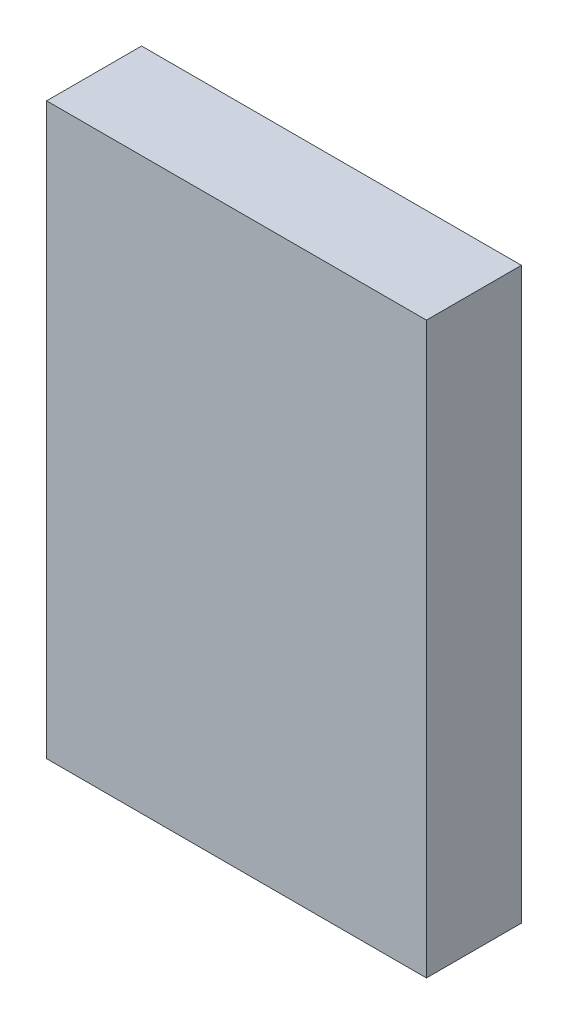
ISO-10303-21;
HEADER;
FILE_DESCRIPTION(('STEP AP214'),'2;1');
FILE_NAME('part.step','',(''),(''),'','','');
FILE_SCHEMA(('AUTOMOTIVE_DESIGN { 1 0 10303 214 1 1 1 1 }'));
ENDSEC;
DATA;
#1=APPLICATION_CONTEXT('core data for automotive mechanical design processes');
#2=APPLICATION_PROTOCOL_DEFINITION('international standard','automotive_design',2000,#1);
#3=PRODUCT_CONTEXT('',#1,'mechanical');
#4=PRODUCT('Part','Part','',(#3));
#5=PRODUCT_RELATED_PRODUCT_CATEGORY('part','',(#4));
#6=PRODUCT_DEFINITION_FORMATION('','',#4);
#7=PRODUCT_DEFINITION_CONTEXT('part definition',#1,'design');
#8=PRODUCT_DEFINITION('design','',#6,#7);
#9=PRODUCT_DEFINITION_SHAPE('','',#8);
#10=(LENGTH_UNIT() NAMED_UNIT(*) SI_UNIT(.MILLI.,.METRE.));
#11=(NAMED_UNIT(*) PLANE_ANGLE_UNIT() SI_UNIT($,.RADIAN.));
#12=(NAMED_UNIT(*) SI_UNIT($,.STERADIAN.) SOLID_ANGLE_UNIT());
#13=UNCERTAINTY_MEASURE_WITH_UNIT(LENGTH_MEASURE(1.E-05),#10,'distance_accuracy_value','');
#14=(GEOMETRIC_REPRESENTATION_CONTEXT(3) GLOBAL_UNCERTAINTY_ASSIGNED_CONTEXT((#13)) GLOBAL_UNIT_ASSIGNED_CONTEXT((#10,
#11,#12)) REPRESENTATION_CONTEXT('',''));
#15=CARTESIAN_POINT('',(0.,0.,0.));
#16=DIRECTION('',(0.,0.,1.));
#17=DIRECTION('',(1.,0.,0.));
#18=AXIS2_PLACEMENT_3D('',#15,#16,#17);
#19=CARTESIAN_POINT('',(0.,0.,0.));
#20=DIRECTION('',(0.,0.,1.));
#21=DIRECTION('',(1.,0.,0.));
#22=AXIS2_PLACEMENT_3D('',#19,#20,#21);
#23=PLANE('',#22);
#24=DIRECTION('',(0.,-1.,0.));
#25=VECTOR('',#24,1.);
#26=CARTESIAN_POINT('',(-15.,-135.745255903937,0.));
#27=LINE('',#26,#25);
#28=CARTESIAN_POINT('',(-15.,-135.745255903937,0.));
#29=VERTEX_POINT('',#28);
#30=CARTESIAN_POINT('',(-15.,-195.745255903937,0.));
#31=VERTEX_POINT('',#30);
#32=EDGE_CURVE('E142',#29,#31,#27,.T.);
#33=ORIENTED_EDGE('',*,*,#32,.F.);
#34=DIRECTION('',(-1.,0.,0.));
#35=VECTOR('',#34,1.);
#36=CARTESIAN_POINT('',(-15.,-135.745255903937,0.));
#37=LINE('',#36,#35);
#38=CARTESIAN_POINT('',(25.,-135.745255903937,0.));
#39=VERTEX_POINT('',#38);
#40=EDGE_CURVE('E69',#39,#29,#37,.T.);
#41=ORIENTED_EDGE('',*,*,#40,.F.);
#42=DIRECTION('',(0.,1.,0.));
#43=VECTOR('',#42,1.);
#44=CARTESIAN_POINT('',(25.,-135.745255903937,0.));
#45=LINE('',#44,#43);
#46=CARTESIAN_POINT('',(25.,-195.745255903937,0.));
#47=VERTEX_POINT('',#46);
#48=EDGE_CURVE('E256',#47,#39,#45,.T.);
#49=ORIENTED_EDGE('',*,*,#48,.F.);
#50=DIRECTION('',(1.,0.,0.));
#51=VECTOR('',#50,1.);
#52=CARTESIAN_POINT('',(-15.,-195.745255903937,0.));
#53=LINE('',#52,#51);
#54=EDGE_CURVE('E253',#31,#47,#53,.T.);
#55=ORIENTED_EDGE('',*,*,#54,.F.);
#56=EDGE_LOOP('',(#33,#41,#49,#55));
#57=FACE_BOUND('',#56,.T.);
#58=CARTESIAN_POINT('',(4.99999999999999,-165.745255903937,0.));
#59=DIRECTION('',(0.,0.,1.));
#60=DIRECTION('',(-1.,0.,0.));
#61=AXIS2_PLACEMENT_3D('',#58,#59,#60);
#62=CIRCLE('',#61,5.99999999999999);
#63=CARTESIAN_POINT('',(9.49999999999998,-169.713882870534,0.));
#64=VERTEX_POINT('',#63);
#65=CARTESIAN_POINT('',(9.49999999999998,-161.77662893734,0.));
#66=VERTEX_POINT('',#65);
#67=EDGE_CURVE('E61',#64,#66,#62,.T.);
#68=ORIENTED_EDGE('',*,*,#67,.T.);
#69=DIRECTION('',(-0.155245679095351,0.987875892570632,0.));
#70=VECTOR('',#69,1.);
#71=CARTESIAN_POINT('',(9.49999999999998,-161.77662893734,0.));
#72=LINE('',#71,#70);
#73=CARTESIAN_POINT('',(7.46968973142657,-148.857141706198,0.));
#74=VERTEX_POINT('',#73);
#75=EDGE_CURVE('E201',#66,#74,#72,.T.);
#76=ORIENTED_EDGE('',*,*,#75,.T.);
#77=CARTESIAN_POINT('',(4.99999999999999,-149.245255903937,0.));
#78=DIRECTION('',(0.,0.,1.));
#79=DIRECTION('',(1.,0.,0.));
#80=AXIS2_PLACEMENT_3D('',#77,#78,#79);
#81=CIRCLE('',#80,2.5);
#82=CARTESIAN_POINT('',(2.53031026857342,-148.857141706198,0.));
#83=VERTEX_POINT('',#82);
#84=EDGE_CURVE('E205',#74,#83,#81,.T.);
#85=ORIENTED_EDGE('',*,*,#84,.T.);
#86=DIRECTION('',(-0.155245679095352,-0.987875892570632,0.));
#87=VECTOR('',#86,1.);
#88=CARTESIAN_POINT('',(2.53031026857341,-148.857141706198,0.));
#89=LINE('',#88,#87);
#90=CARTESIAN_POINT('',(0.499999999999983,-161.77662893734,0.));
#91=VERTEX_POINT('',#90);
#92=EDGE_CURVE('E209',#83,#91,#89,.T.);
#93=ORIENTED_EDGE('',*,*,#92,.T.);
#94=CARTESIAN_POINT('',(4.99999999999999,-165.745255903937,0.));
#95=DIRECTION('',(0.,0.,1.));
#96=DIRECTION('',(1.,0.,0.));
#97=AXIS2_PLACEMENT_3D('',#94,#95,#96);
#98=CIRCLE('',#97,6.00000000000002);
#99=CARTESIAN_POINT('',(0.499999999999974,-169.713882870534,0.));
#100=VERTEX_POINT('',#99);
#101=EDGE_CURVE('E213',#91,#100,#98,.T.);
#102=ORIENTED_EDGE('',*,*,#101,.T.);
#103=DIRECTION('',(0.155245679095353,-0.987875892570632,0.));
#104=VECTOR('',#103,1.);
#105=CARTESIAN_POINT('',(0.499999999999986,-169.713882870534,0.));
#106=LINE('',#105,#104);
#107=CARTESIAN_POINT('',(2.53031026857342,-182.633370101675,0.));
#108=VERTEX_POINT('',#107);
#109=EDGE_CURVE('E217',#100,#108,#106,.T.);
#110=ORIENTED_EDGE('',*,*,#109,.T.);
#111=CARTESIAN_POINT('',(4.99999999999999,-182.245255903937,0.));
#112=DIRECTION('',(0.,0.,1.));
#113=DIRECTION('',(-1.,0.,0.));
#114=AXIS2_PLACEMENT_3D('',#111,#112,#113);
#115=CIRCLE('',#114,2.49999999999999);
#116=CARTESIAN_POINT('',(7.46968973142657,-182.633370101675,0.));
#117=VERTEX_POINT('',#116);
#118=EDGE_CURVE('E221',#108,#117,#115,.T.);
#119=ORIENTED_EDGE('',*,*,#118,.T.);
#120=DIRECTION('',(0.155245679095352,0.987875892570632,0.));
#121=VECTOR('',#120,1.);
#122=CARTESIAN_POINT('',(9.49999999999998,-169.713882870534,0.));
#123=LINE('',#122,#121);
#124=EDGE_CURVE('E170',#117,#64,#123,.T.);
#125=ORIENTED_EDGE('',*,*,#124,.T.);
#126=EDGE_LOOP('',(#68,#76,#85,#93,#102,#110,#119,#125));
#127=FACE_BOUND('',#126,.T.);
#128=ADVANCED_FACE('F45',(#57,#127),#23,.F.);
#129=CARTESIAN_POINT('',(-15.,-135.745255903937,5.));
#130=DIRECTION('',(1.,0.,0.));
#131=DIRECTION('',(0.,1.,0.));
#132=AXIS2_PLACEMENT_3D('',#129,#130,#131);
#133=PLANE('',#132);
#134=ORIENTED_EDGE('',*,*,#32,.T.);
#135=DIRECTION('',(0.,0.,-1.));
#136=VECTOR('',#135,1.);
#137=CARTESIAN_POINT('',(-15.,-195.745255903937,5.));
#138=LINE('',#137,#136);
#139=CARTESIAN_POINT('',(-15.,-195.745255903937,10.));
#140=VERTEX_POINT('',#139);
#141=EDGE_CURVE('E11',#140,#31,#138,.T.);
#142=ORIENTED_EDGE('',*,*,#141,.F.);
#143=DIRECTION('',(0.,-1.,0.));
#144=VECTOR('',#143,1.);
#145=CARTESIAN_POINT('',(-15.,-135.745255903937,10.));
#146=LINE('',#145,#144);
#147=CARTESIAN_POINT('',(-15.,-135.745255903937,10.));
#148=VERTEX_POINT('',#147);
#149=EDGE_CURVE('E140',#148,#140,#146,.T.);
#150=ORIENTED_EDGE('',*,*,#149,.F.);
#151=DIRECTION('',(0.,0.,-1.));
#152=VECTOR('',#151,1.);
#153=CARTESIAN_POINT('',(-15.,-135.745255903937,5.));
#154=LINE('',#153,#152);
#155=EDGE_CURVE('E261',#148,#29,#154,.T.);
#156=ORIENTED_EDGE('',*,*,#155,.T.);
#157=EDGE_LOOP('',(#134,#142,#150,#156));
#158=FACE_BOUND('',#157,.T.);
#159=ADVANCED_FACE('F47',(#158),#133,.F.);
#160=CARTESIAN_POINT('',(-15.,-195.745255903937,5.));
#161=DIRECTION('',(0.,1.,0.));
#162=DIRECTION('',(0.,0.,1.));
#163=AXIS2_PLACEMENT_3D('',#160,#161,#162);
#164=PLANE('',#163);
#165=ORIENTED_EDGE('',*,*,#54,.T.);
#166=DIRECTION('',(0.,0.,-1.));
#167=VECTOR('',#166,1.);
#168=CARTESIAN_POINT('',(25.,-195.745255903937,5.));
#169=LINE('',#168,#167);
#170=CARTESIAN_POINT('',(25.,-195.745255903937,10.));
#171=VERTEX_POINT('',#170);
#172=EDGE_CURVE('E54',#171,#47,#169,.T.);
#173=ORIENTED_EDGE('',*,*,#172,.F.);
#174=DIRECTION('',(1.,0.,0.));
#175=VECTOR('',#174,1.);
#176=CARTESIAN_POINT('',(-15.,-195.745255903937,10.));
#177=LINE('',#176,#175);
#178=EDGE_CURVE('E145',#140,#171,#177,.T.);
#179=ORIENTED_EDGE('',*,*,#178,.F.);
#180=ORIENTED_EDGE('',*,*,#141,.T.);
#181=EDGE_LOOP('',(#165,#173,#179,#180));
#182=FACE_BOUND('',#181,.T.);
#183=ADVANCED_FACE('F146',(#182),#164,.F.);
#184=CARTESIAN_POINT('',(25.,-135.745255903937,5.));
#185=DIRECTION('',(-1.,0.,0.));
#186=DIRECTION('',(0.,-1.,0.));
#187=AXIS2_PLACEMENT_3D('',#184,#185,#186);
#188=PLANE('',#187);
#189=ORIENTED_EDGE('',*,*,#48,.T.);
#190=DIRECTION('',(0.,0.,-1.));
#191=VECTOR('',#190,1.);
#192=CARTESIAN_POINT('',(25.,-135.745255903937,5.));
#193=LINE('',#192,#191);
#194=CARTESIAN_POINT('',(25.,-135.745255903937,10.));
#195=VERTEX_POINT('',#194);
#196=EDGE_CURVE('E264',#195,#39,#193,.T.);
#197=ORIENTED_EDGE('',*,*,#196,.F.);
#198=DIRECTION('',(0.,1.,0.));
#199=VECTOR('',#198,1.);
#200=CARTESIAN_POINT('',(25.,-135.745255903937,10.));
#201=LINE('',#200,#199);
#202=EDGE_CURVE('E152',#171,#195,#201,.T.);
#203=ORIENTED_EDGE('',*,*,#202,.F.);
#204=ORIENTED_EDGE('',*,*,#172,.T.);
#205=EDGE_LOOP('',(#189,#197,#203,#204));
#206=FACE_BOUND('',#205,.T.);
#207=ADVANCED_FACE('F269',(#206),#188,.F.);
#208=CARTESIAN_POINT('',(-15.,-135.745255903937,5.));
#209=DIRECTION('',(0.,-1.,0.));
#210=DIRECTION('',(0.,0.,-1.));
#211=AXIS2_PLACEMENT_3D('',#208,#209,#210);
#212=PLANE('',#211);
#213=ORIENTED_EDGE('',*,*,#40,.T.);
#214=ORIENTED_EDGE('',*,*,#155,.F.);
#215=DIRECTION('',(-1.,0.,0.));
#216=VECTOR('',#215,1.);
#217=CARTESIAN_POINT('',(-15.,-135.745255903937,10.));
#218=LINE('',#217,#216);
#219=EDGE_CURVE('E157',#195,#148,#218,.T.);
#220=ORIENTED_EDGE('',*,*,#219,.F.);
#221=ORIENTED_EDGE('',*,*,#196,.T.);
#222=EDGE_LOOP('',(#213,#214,#220,#221));
#223=FACE_BOUND('',#222,.T.);
#224=ADVANCED_FACE('F326',(#223),#212,.F.);
#225=CARTESIAN_POINT('',(4.99999999999999,-165.745255903937,5.));
#226=DIRECTION('',(0.,0.,-1.));
#227=DIRECTION('',(-1.,0.,0.));
#228=AXIS2_PLACEMENT_3D('',#225,#226,#227);
#229=CYLINDRICAL_SURFACE('',#228,5.99999999999999);
#230=ORIENTED_EDGE('',*,*,#67,.F.);
#231=DIRECTION('',(0.,0.,-1.));
#232=VECTOR('',#231,1.);
#233=CARTESIAN_POINT('',(9.49999999999998,-169.713882870534,5.));
#234=LINE('',#233,#232);
#235=CARTESIAN_POINT('',(9.49999999999998,-169.713882870534,5.));
#236=VERTEX_POINT('',#235);
#237=EDGE_CURVE('E198',#236,#64,#234,.T.);
#238=ORIENTED_EDGE('',*,*,#237,.F.);
#239=CARTESIAN_POINT('',(4.99999999999999,-165.745255903937,5.));
#240=DIRECTION('',(0.,0.,1.));
#241=DIRECTION('',(-1.,0.,0.));
#242=AXIS2_PLACEMENT_3D('',#239,#240,#241);
#243=CIRCLE('',#242,5.99999999999999);
#244=CARTESIAN_POINT('',(9.49999999999998,-161.77662893734,5.));
#245=VERTEX_POINT('',#244);
#246=EDGE_CURVE('E165',#236,#245,#243,.T.);
#247=ORIENTED_EDGE('',*,*,#246,.T.);
#248=DIRECTION('',(0.,0.,-1.));
#249=VECTOR('',#248,1.);
#250=CARTESIAN_POINT('',(9.49999999999998,-161.77662893734,5.));
#251=LINE('',#250,#249);
#252=EDGE_CURVE('E248',#245,#66,#251,.T.);
#253=ORIENTED_EDGE('',*,*,#252,.T.);
#254=EDGE_LOOP('',(#230,#238,#247,#253));
#255=FACE_BOUND('',#254,.T.);
#256=ADVANCED_FACE('F279',(#255),#229,.F.);
#257=CARTESIAN_POINT('',(9.49999999999998,-161.77662893734,5.));
#258=DIRECTION('',(-0.987875892570632,-0.155245679095351,0.));
#259=DIRECTION('',(0.155245679095351,-0.987875892570632,0.));
#260=AXIS2_PLACEMENT_3D('',#257,#258,#259);
#261=PLANE('',#260);
#262=ORIENTED_EDGE('',*,*,#75,.F.);
#263=ORIENTED_EDGE('',*,*,#252,.F.);
#264=DIRECTION('',(-0.155245679095351,0.987875892570632,0.));
#265=VECTOR('',#264,1.);
#266=CARTESIAN_POINT('',(9.49999999999998,-161.77662893734,5.));
#267=LINE('',#266,#265);
#268=CARTESIAN_POINT('',(7.46968973142657,-148.857141706198,5.));
#269=VERTEX_POINT('',#268);
#270=EDGE_CURVE('E169',#245,#269,#267,.T.);
#271=ORIENTED_EDGE('',*,*,#270,.T.);
#272=DIRECTION('',(0.,0.,-1.));
#273=VECTOR('',#272,1.);
#274=CARTESIAN_POINT('',(7.46968973142657,-148.857141706198,5.));
#275=LINE('',#274,#273);
#276=EDGE_CURVE('E245',#269,#74,#275,.T.);
#277=ORIENTED_EDGE('',*,*,#276,.T.);
#278=EDGE_LOOP('',(#262,#263,#271,#277));
#279=FACE_BOUND('',#278,.T.);
#280=ADVANCED_FACE('F283',(#279),#261,.T.);
#281=CARTESIAN_POINT('',(4.99999999999999,-149.245255903937,5.));
#282=DIRECTION('',(0.,0.,-1.));
#283=DIRECTION('',(-1.,0.,0.));
#284=AXIS2_PLACEMENT_3D('',#281,#282,#283);
#285=CYLINDRICAL_SURFACE('',#284,2.5);
#286=ORIENTED_EDGE('',*,*,#84,.F.);
#287=ORIENTED_EDGE('',*,*,#276,.F.);
#288=CARTESIAN_POINT('',(4.99999999999999,-149.245255903937,5.));
#289=DIRECTION('',(0.,0.,1.));
#290=DIRECTION('',(1.,0.,0.));
#291=AXIS2_PLACEMENT_3D('',#288,#289,#290);
#292=CIRCLE('',#291,2.5);
#293=CARTESIAN_POINT('',(2.53031026857342,-148.857141706198,5.));
#294=VERTEX_POINT('',#293);
#295=EDGE_CURVE('E174',#269,#294,#292,.T.);
#296=ORIENTED_EDGE('',*,*,#295,.T.);
#297=DIRECTION('',(0.,0.,-1.));
#298=VECTOR('',#297,1.);
#299=CARTESIAN_POINT('',(2.53031026857342,-148.857141706198,5.));
#300=LINE('',#299,#298);
#301=EDGE_CURVE('E242',#294,#83,#300,.T.);
#302=ORIENTED_EDGE('',*,*,#301,.T.);
#303=EDGE_LOOP('',(#286,#287,#296,#302));
#304=FACE_BOUND('',#303,.T.);
#305=ADVANCED_FACE('F287',(#304),#285,.F.);
#306=CARTESIAN_POINT('',(2.53031026857341,-148.857141706198,5.));
#307=DIRECTION('',(0.987875892570632,-0.155245679095352,0.));
#308=DIRECTION('',(0.155245679095352,0.987875892570632,0.));
#309=AXIS2_PLACEMENT_3D('',#306,#307,#308);
#310=PLANE('',#309);
#311=ORIENTED_EDGE('',*,*,#92,.F.);
#312=ORIENTED_EDGE('',*,*,#301,.F.);
#313=DIRECTION('',(-0.155245679095352,-0.987875892570632,0.));
#314=VECTOR('',#313,1.);
#315=CARTESIAN_POINT('',(2.53031026857341,-148.857141706198,5.));
#316=LINE('',#315,#314);
#317=CARTESIAN_POINT('',(0.499999999999983,-161.77662893734,5.));
#318=VERTEX_POINT('',#317);
#319=EDGE_CURVE('E178',#294,#318,#316,.T.);
#320=ORIENTED_EDGE('',*,*,#319,.T.);
#321=DIRECTION('',(0.,0.,-1.));
#322=VECTOR('',#321,1.);
#323=CARTESIAN_POINT('',(0.499999999999983,-161.77662893734,5.));
#324=LINE('',#323,#322);
#325=EDGE_CURVE('E239',#318,#91,#324,.T.);
#326=ORIENTED_EDGE('',*,*,#325,.T.);
#327=EDGE_LOOP('',(#311,#312,#320,#326));
#328=FACE_BOUND('',#327,.T.);
#329=ADVANCED_FACE('F292',(#328),#310,.T.);
#330=CARTESIAN_POINT('',(4.99999999999999,-165.745255903937,5.));
#331=DIRECTION('',(0.,0.,-1.));
#332=DIRECTION('',(-1.,0.,0.));
#333=AXIS2_PLACEMENT_3D('',#330,#331,#332);
#334=CYLINDRICAL_SURFACE('',#333,6.00000000000002);
#335=ORIENTED_EDGE('',*,*,#101,.F.);
#336=ORIENTED_EDGE('',*,*,#325,.F.);
#337=CARTESIAN_POINT('',(4.99999999999999,-165.745255903937,5.));
#338=DIRECTION('',(0.,0.,1.));
#339=DIRECTION('',(1.,0.,0.));
#340=AXIS2_PLACEMENT_3D('',#337,#338,#339);
#341=CIRCLE('',#340,6.00000000000002);
#342=CARTESIAN_POINT('',(0.499999999999974,-169.713882870534,5.));
#343=VERTEX_POINT('',#342);
#344=EDGE_CURVE('E182',#318,#343,#341,.T.);
#345=ORIENTED_EDGE('',*,*,#344,.T.);
#346=DIRECTION('',(0.,0.,-1.));
#347=VECTOR('',#346,1.);
#348=CARTESIAN_POINT('',(0.499999999999974,-169.713882870534,5.));
#349=LINE('',#348,#347);
#350=EDGE_CURVE('E236',#343,#100,#349,.T.);
#351=ORIENTED_EDGE('',*,*,#350,.T.);
#352=EDGE_LOOP('',(#335,#336,#345,#351));
#353=FACE_BOUND('',#352,.T.);
#354=ADVANCED_FACE('F295',(#353),#334,.F.);
#355=CARTESIAN_POINT('',(0.499999999999986,-169.713882870534,5.));
#356=DIRECTION('',(0.987875892570632,0.155245679095353,0.));
#357=DIRECTION('',(-0.155245679095353,0.987875892570632,0.));
#358=AXIS2_PLACEMENT_3D('',#355,#356,#357);
#359=PLANE('',#358);
#360=ORIENTED_EDGE('',*,*,#109,.F.);
#361=ORIENTED_EDGE('',*,*,#350,.F.);
#362=DIRECTION('',(0.155245679095353,-0.987875892570632,0.));
#363=VECTOR('',#362,1.);
#364=CARTESIAN_POINT('',(0.499999999999986,-169.713882870534,5.));
#365=LINE('',#364,#363);
#366=CARTESIAN_POINT('',(2.53031026857342,-182.633370101675,5.));
#367=VERTEX_POINT('',#366);
#368=EDGE_CURVE('E186',#343,#367,#365,.T.);
#369=ORIENTED_EDGE('',*,*,#368,.T.);
#370=DIRECTION('',(0.,0.,-1.));
#371=VECTOR('',#370,1.);
#372=CARTESIAN_POINT('',(2.53031026857342,-182.633370101675,5.));
#373=LINE('',#372,#371);
#374=EDGE_CURVE('E233',#367,#108,#373,.T.);
#375=ORIENTED_EDGE('',*,*,#374,.T.);
#376=EDGE_LOOP('',(#360,#361,#369,#375));
#377=FACE_BOUND('',#376,.T.);
#378=ADVANCED_FACE('F299',(#377),#359,.T.);
#379=CARTESIAN_POINT('',(4.99999999999999,-182.245255903937,5.));
#380=DIRECTION('',(0.,0.,-1.));
#381=DIRECTION('',(-1.,0.,0.));
#382=AXIS2_PLACEMENT_3D('',#379,#380,#381);
#383=CYLINDRICAL_SURFACE('',#382,2.49999999999999);
#384=ORIENTED_EDGE('',*,*,#118,.F.);
#385=ORIENTED_EDGE('',*,*,#374,.F.);
#386=CARTESIAN_POINT('',(4.99999999999999,-182.245255903937,5.));
#387=DIRECTION('',(0.,0.,1.));
#388=DIRECTION('',(-1.,0.,0.));
#389=AXIS2_PLACEMENT_3D('',#386,#387,#388);
#390=CIRCLE('',#389,2.49999999999999);
#391=CARTESIAN_POINT('',(7.46968973142656,-182.633370101675,5.));
#392=VERTEX_POINT('',#391);
#393=EDGE_CURVE('E190',#367,#392,#390,.T.);
#394=ORIENTED_EDGE('',*,*,#393,.T.);
#395=DIRECTION('',(0.,0.,-1.));
#396=VECTOR('',#395,1.);
#397=CARTESIAN_POINT('',(7.46968973142657,-182.633370101675,5.));
#398=LINE('',#397,#396);
#399=EDGE_CURVE('E230',#392,#117,#398,.T.);
#400=ORIENTED_EDGE('',*,*,#399,.T.);
#401=EDGE_LOOP('',(#384,#385,#394,#400));
#402=FACE_BOUND('',#401,.T.);
#403=ADVANCED_FACE('F302',(#402),#383,.F.);
#404=CARTESIAN_POINT('',(9.49999999999998,-169.713882870534,5.));
#405=DIRECTION('',(-0.987875892570632,0.155245679095352,0.));
#406=DIRECTION('',(-0.155245679095352,-0.987875892570632,0.));
#407=AXIS2_PLACEMENT_3D('',#404,#405,#406);
#408=PLANE('',#407);
#409=ORIENTED_EDGE('',*,*,#124,.F.);
#410=ORIENTED_EDGE('',*,*,#399,.F.);
#411=DIRECTION('',(0.155245679095352,0.987875892570632,0.));
#412=VECTOR('',#411,1.);
#413=CARTESIAN_POINT('',(9.49999999999998,-169.713882870534,5.));
#414=LINE('',#413,#412);
#415=EDGE_CURVE('E194',#392,#236,#414,.T.);
#416=ORIENTED_EDGE('',*,*,#415,.T.);
#417=ORIENTED_EDGE('',*,*,#237,.T.);
#418=EDGE_LOOP('',(#409,#410,#416,#417));
#419=FACE_BOUND('',#418,.T.);
#420=ADVANCED_FACE('F278',(#419),#408,.T.);
#421=CARTESIAN_POINT('',(0.,0.,5.));
#422=DIRECTION('',(0.,0.,1.));
#423=DIRECTION('',(1.,0.,0.));
#424=AXIS2_PLACEMENT_3D('',#421,#422,#423);
#425=PLANE('',#424);
#426=ORIENTED_EDGE('',*,*,#270,.F.);
#427=ORIENTED_EDGE('',*,*,#246,.F.);
#428=ORIENTED_EDGE('',*,*,#415,.F.);
#429=ORIENTED_EDGE('',*,*,#393,.F.);
#430=ORIENTED_EDGE('',*,*,#368,.F.);
#431=ORIENTED_EDGE('',*,*,#344,.F.);
#432=ORIENTED_EDGE('',*,*,#319,.F.);
#433=ORIENTED_EDGE('',*,*,#295,.F.);
#434=EDGE_LOOP('',(#426,#427,#428,#429,#430,#431,#432,#433));
#435=FACE_BOUND('',#434,.T.);
#436=ADVANCED_FACE('F303',(#435),#425,.F.);
#437=CARTESIAN_POINT('',(0.,0.,10.));
#438=DIRECTION('',(0.,0.,1.));
#439=DIRECTION('',(1.,0.,0.));
#440=AXIS2_PLACEMENT_3D('',#437,#438,#439);
#441=PLANE('',#440);
#442=ORIENTED_EDGE('',*,*,#149,.T.);
#443=ORIENTED_EDGE('',*,*,#178,.T.);
#444=ORIENTED_EDGE('',*,*,#202,.T.);
#445=ORIENTED_EDGE('',*,*,#219,.T.);
#446=EDGE_LOOP('',(#442,#443,#444,#445));
#447=FACE_BOUND('',#446,.T.);
#448=ADVANCED_FACE('F155',(#447),#441,.T.);
#449=CLOSED_SHELL('',(#128,#159,#183,#207,#224,#256,#280,#305,#329,#354,#378,#403,#420,#436,#448));
#450=MANIFOLD_SOLID_BREP('B2',#449);
#451=ADVANCED_BREP_SHAPE_REPRESENTATION('',(#18,#450),#14);
#452=SHAPE_DEFINITION_REPRESENTATION(#9,#451);
ENDSEC;
END-ISO-10303-21;
